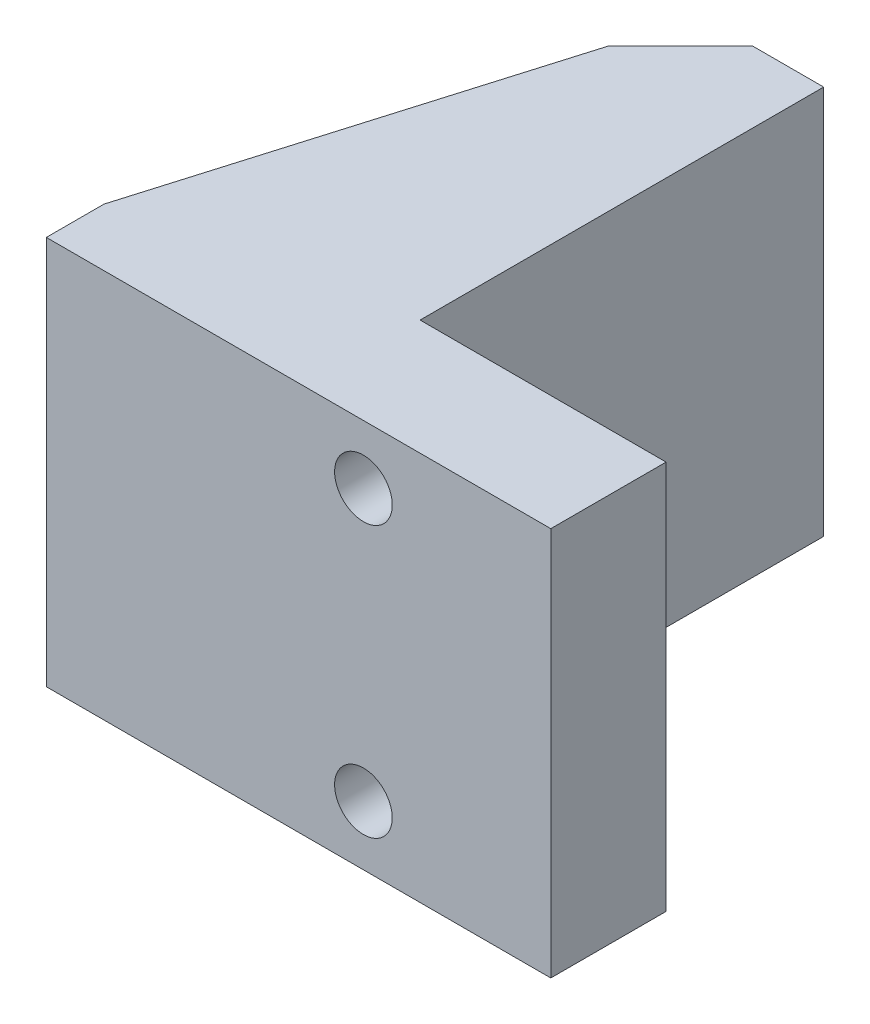
ISO-10303-21;
HEADER;
FILE_DESCRIPTION(('STEP AP214'),'2;1');
FILE_NAME('part.step','',(''),(''),'','','');
FILE_SCHEMA(('AUTOMOTIVE_DESIGN { 1 0 10303 214 1 1 1 1 }'));
ENDSEC;
DATA;
#1=APPLICATION_CONTEXT('core data for automotive mechanical design processes');
#2=APPLICATION_PROTOCOL_DEFINITION('international standard','automotive_design',2000,#1);
#3=PRODUCT_CONTEXT('',#1,'mechanical');
#4=PRODUCT('Part','Part','',(#3));
#5=PRODUCT_RELATED_PRODUCT_CATEGORY('part','',(#4));
#6=PRODUCT_DEFINITION_FORMATION('','',#4);
#7=PRODUCT_DEFINITION_CONTEXT('part definition',#1,'design');
#8=PRODUCT_DEFINITION('design','',#6,#7);
#9=PRODUCT_DEFINITION_SHAPE('','',#8);
#10=(LENGTH_UNIT() NAMED_UNIT(*) SI_UNIT(.MILLI.,.METRE.));
#11=(NAMED_UNIT(*) PLANE_ANGLE_UNIT() SI_UNIT($,.RADIAN.));
#12=(NAMED_UNIT(*) SI_UNIT($,.STERADIAN.) SOLID_ANGLE_UNIT());
#13=UNCERTAINTY_MEASURE_WITH_UNIT(LENGTH_MEASURE(1.E-05),#10,'distance_accuracy_value','');
#14=(GEOMETRIC_REPRESENTATION_CONTEXT(3) GLOBAL_UNCERTAINTY_ASSIGNED_CONTEXT((#13)) GLOBAL_UNIT_ASSIGNED_CONTEXT((#10,
#11,#12)) REPRESENTATION_CONTEXT('',''));
#15=CARTESIAN_POINT('',(0.,0.,0.));
#16=DIRECTION('',(0.,0.,1.));
#17=DIRECTION('',(1.,0.,0.));
#18=AXIS2_PLACEMENT_3D('',#15,#16,#17);
#19=CARTESIAN_POINT('',(0.,0.,5.08));
#20=DIRECTION('',(1.,0.,0.));
#21=DIRECTION('',(0.,0.,-1.));
#22=AXIS2_PLACEMENT_3D('',#19,#20,#21);
#23=PLANE('',#22);
#24=DIRECTION('',(0.,0.,1.));
#25=VECTOR('',#24,1.);
#26=CARTESIAN_POINT('',(0.,-14.605,-14.605));
#27=LINE('',#26,#25);
#28=CARTESIAN_POINT('',(0.,-14.605,-14.605));
#29=VERTEX_POINT('',#28);
#30=CARTESIAN_POINT('',(0.,-14.605,2.54));
#31=VERTEX_POINT('',#30);
#32=EDGE_CURVE('E51',#29,#31,#27,.T.);
#33=ORIENTED_EDGE('',*,*,#32,.T.);
#34=DIRECTION('',(0.,-1.,0.));
#35=VECTOR('',#34,1.);
#36=CARTESIAN_POINT('',(0.,0.,2.54));
#37=LINE('',#36,#35);
#38=CARTESIAN_POINT('',(0.,-2.54,2.54));
#39=VERTEX_POINT('',#38);
#40=EDGE_CURVE('E38',#39,#31,#37,.T.);
#41=ORIENTED_EDGE('',*,*,#40,.F.);
#42=DIRECTION('',(0.,0.,-1.));
#43=VECTOR('',#42,1.);
#44=CARTESIAN_POINT('',(0.,-2.54,-14.605));
#45=LINE('',#44,#43);
#46=CARTESIAN_POINT('',(0.,-2.54,-14.605));
#47=VERTEX_POINT('',#46);
#48=EDGE_CURVE('E150',#39,#47,#45,.T.);
#49=ORIENTED_EDGE('',*,*,#48,.T.);
#50=DIRECTION('',(0.,-1.,0.));
#51=VECTOR('',#50,1.);
#52=CARTESIAN_POINT('',(0.,0.,-14.605));
#53=LINE('',#52,#51);
#54=EDGE_CURVE('E202',#47,#29,#53,.T.);
#55=ORIENTED_EDGE('',*,*,#54,.T.);
#56=EDGE_LOOP('',(#33,#41,#49,#55));
#57=FACE_BOUND('',#56,.T.);
#58=ADVANCED_FACE('F34',(#57),#23,.F.);
#59=CARTESIAN_POINT('',(-5.08,0.,2.54));
#60=DIRECTION('',(0.,0.,1.));
#61=DIRECTION('',(0.,-1.,0.));
#62=AXIS2_PLACEMENT_3D('',#59,#60,#61);
#63=PLANE('',#62);
#64=DIRECTION('',(-1.,0.,0.));
#65=VECTOR('',#64,1.);
#66=CARTESIAN_POINT('',(0.,-14.605,2.54));
#67=LINE('',#66,#65);
#68=CARTESIAN_POINT('',(-5.08,-14.605,2.54));
#69=VERTEX_POINT('',#68);
#70=EDGE_CURVE('E58',#31,#69,#67,.T.);
#71=ORIENTED_EDGE('',*,*,#70,.T.);
#72=DIRECTION('',(0.,-1.,0.));
#73=VECTOR('',#72,1.);
#74=CARTESIAN_POINT('',(-5.08,0.,2.54));
#75=LINE('',#74,#73);
#76=CARTESIAN_POINT('',(-5.08,-2.54,2.54));
#77=VERTEX_POINT('',#76);
#78=EDGE_CURVE('E163',#77,#69,#75,.T.);
#79=ORIENTED_EDGE('',*,*,#78,.F.);
#80=DIRECTION('',(1.,0.,0.));
#81=VECTOR('',#80,1.);
#82=CARTESIAN_POINT('',(0.,-2.54,2.54));
#83=LINE('',#82,#81);
#84=EDGE_CURVE('E148',#77,#39,#83,.T.);
#85=ORIENTED_EDGE('',*,*,#84,.T.);
#86=ORIENTED_EDGE('',*,*,#40,.T.);
#87=EDGE_LOOP('',(#71,#79,#85,#86));
#88=FACE_BOUND('',#87,.T.);
#89=ADVANCED_FACE('F219',(#88),#63,.F.);
#90=CARTESIAN_POINT('',(0.,0.,0.));
#91=DIRECTION('',(0.,0.,1.));
#92=DIRECTION('',(1.,0.,0.));
#93=AXIS2_PLACEMENT_3D('',#90,#91,#92);
#94=PLANE('',#93);
#95=CARTESIAN_POINT('',(8.89,-2.5908,0.));
#96=DIRECTION('',(0.,0.,-1.));
#97=DIRECTION('',(-1.,0.,0.));
#98=AXIS2_PLACEMENT_3D('',#95,#96,#97);
#99=CIRCLE('',#98,2.54);
#100=CARTESIAN_POINT('',(6.35,-2.5908,0.));
#101=VERTEX_POINT('',#100);
#102=EDGE_CURVE('E327',#101,#101,#99,.T.);
#103=ORIENTED_EDGE('',*,*,#102,.F.);
#104=EDGE_LOOP('',(#103));
#105=FACE_BOUND('',#104,.T.);
#106=CARTESIAN_POINT('',(8.89,-14.5288,0.));
#107=DIRECTION('',(0.,0.,-1.));
#108=DIRECTION('',(-1.,0.,0.));
#109=AXIS2_PLACEMENT_3D('',#106,#107,#108);
#110=CIRCLE('',#109,2.54);
#111=CARTESIAN_POINT('',(6.35,-14.5288,0.));
#112=VERTEX_POINT('',#111);
#113=EDGE_CURVE('E195',#112,#112,#110,.T.);
#114=ORIENTED_EDGE('',*,*,#113,.F.);
#115=EDGE_LOOP('',(#114));
#116=FACE_BOUND('',#115,.T.);
#117=DIRECTION('',(0.,-1.,0.));
#118=VECTOR('',#117,1.);
#119=CARTESIAN_POINT('',(6.30770467836258,0.,0.));
#120=LINE('',#119,#118);
#121=CARTESIAN_POINT('',(6.30770467836258,0.,0.));
#122=VERTEX_POINT('',#121);
#123=CARTESIAN_POINT('',(6.30770467836258,-17.145,0.));
#124=VERTEX_POINT('',#123);
#125=EDGE_CURVE('E167',#122,#124,#120,.T.);
#126=ORIENTED_EDGE('',*,*,#125,.F.);
#127=DIRECTION('',(-1.,0.,0.));
#128=VECTOR('',#127,1.);
#129=CARTESIAN_POINT('',(0.,0.,0.));
#130=LINE('',#129,#128);
#131=CARTESIAN_POINT('',(17.145,0.,0.));
#132=VERTEX_POINT('',#131);
#133=EDGE_CURVE('E300',#132,#122,#130,.T.);
#134=ORIENTED_EDGE('',*,*,#133,.F.);
#135=DIRECTION('',(0.,1.,0.));
#136=VECTOR('',#135,1.);
#137=CARTESIAN_POINT('',(17.145,0.,0.));
#138=LINE('',#137,#136);
#139=CARTESIAN_POINT('',(17.145,-17.145,0.));
#140=VERTEX_POINT('',#139);
#141=EDGE_CURVE('E305',#140,#132,#138,.T.);
#142=ORIENTED_EDGE('',*,*,#141,.F.);
#143=DIRECTION('',(1.,0.,0.));
#144=VECTOR('',#143,1.);
#145=CARTESIAN_POINT('',(0.,-17.145,0.));
#146=LINE('',#145,#144);
#147=EDGE_CURVE('E185',#124,#140,#146,.T.);
#148=ORIENTED_EDGE('',*,*,#147,.F.);
#149=EDGE_LOOP('',(#126,#134,#142,#148));
#150=FACE_BOUND('',#149,.T.);
#151=ADVANCED_FACE('F223',(#105,#116,#150),#94,.F.);
#152=CARTESIAN_POINT('',(8.89,-14.5288,5.08));
#153=DIRECTION('',(0.,0.,-1.));
#154=DIRECTION('',(-1.,0.,0.));
#155=AXIS2_PLACEMENT_3D('',#152,#153,#154);
#156=CYLINDRICAL_SURFACE('',#155,1.27);
#157=CARTESIAN_POINT('',(8.89,-14.5288,5.08));
#158=DIRECTION('',(0.,0.,-1.));
#159=DIRECTION('',(-1.,0.,0.));
#160=AXIS2_PLACEMENT_3D('',#157,#158,#159);
#161=CIRCLE('',#160,1.27);
#162=CARTESIAN_POINT('',(7.62,-14.5288,5.08));
#163=VERTEX_POINT('',#162);
#164=EDGE_CURVE('E319',#163,#163,#161,.T.);
#165=ORIENTED_EDGE('',*,*,#164,.F.);
#166=EDGE_LOOP('',(#165));
#167=FACE_BOUND('',#166,.T.);
#168=CARTESIAN_POINT('',(8.89,-14.5288,2.54));
#169=DIRECTION('',(0.,0.,-1.));
#170=DIRECTION('',(-1.,0.,0.));
#171=AXIS2_PLACEMENT_3D('',#168,#169,#170);
#172=CIRCLE('',#171,1.27);
#173=CARTESIAN_POINT('',(7.62,-14.5288,2.54));
#174=VERTEX_POINT('',#173);
#175=EDGE_CURVE('E311',#174,#174,#172,.F.);
#176=ORIENTED_EDGE('',*,*,#175,.F.);
#177=EDGE_LOOP('',(#176));
#178=FACE_BOUND('',#177,.T.);
#179=ADVANCED_FACE('F240',(#167,#178),#156,.F.);
#180=CARTESIAN_POINT('',(8.89,-2.5908,5.08));
#181=DIRECTION('',(0.,0.,-1.));
#182=DIRECTION('',(-1.,0.,0.));
#183=AXIS2_PLACEMENT_3D('',#180,#181,#182);
#184=CYLINDRICAL_SURFACE('',#183,1.27);
#185=CARTESIAN_POINT('',(8.89,-2.5908,5.08));
#186=DIRECTION('',(0.,0.,-1.));
#187=DIRECTION('',(-1.,0.,0.));
#188=AXIS2_PLACEMENT_3D('',#185,#186,#187);
#189=CIRCLE('',#188,1.27);
#190=CARTESIAN_POINT('',(7.62,-2.5908,5.08));
#191=VERTEX_POINT('',#190);
#192=EDGE_CURVE('E324',#191,#191,#189,.T.);
#193=ORIENTED_EDGE('',*,*,#192,.F.);
#194=EDGE_LOOP('',(#193));
#195=FACE_BOUND('',#194,.T.);
#196=CARTESIAN_POINT('',(8.89,-2.5908,2.54));
#197=DIRECTION('',(0.,0.,-1.));
#198=DIRECTION('',(-1.,0.,0.));
#199=AXIS2_PLACEMENT_3D('',#196,#197,#198);
#200=CIRCLE('',#199,1.27);
#201=CARTESIAN_POINT('',(7.62,-2.5908,2.54));
#202=VERTEX_POINT('',#201);
#203=EDGE_CURVE('E317',#202,#202,#200,.F.);
#204=ORIENTED_EDGE('',*,*,#203,.F.);
#205=EDGE_LOOP('',(#204));
#206=FACE_BOUND('',#205,.T.);
#207=ADVANCED_FACE('F229',(#195,#206),#184,.F.);
#208=CARTESIAN_POINT('',(0.,-17.145,5.08));
#209=DIRECTION('',(0.,1.,0.));
#210=DIRECTION('',(0.,0.,1.));
#211=AXIS2_PLACEMENT_3D('',#208,#209,#210);
#212=PLANE('',#211);
#213=DIRECTION('',(0.284088329691374,0.,-0.958798112708387));
#214=VECTOR('',#213,1.);
#215=CARTESIAN_POINT('',(-5.08,-17.145,2.54));
#216=LINE('',#215,#214);
#217=CARTESIAN_POINT('',(-5.08,-17.145,2.54));
#218=VERTEX_POINT('',#217);
#219=CARTESIAN_POINT('',(0.,-17.145,-14.605));
#220=VERTEX_POINT('',#219);
#221=EDGE_CURVE('E132',#218,#220,#216,.T.);
#222=ORIENTED_EDGE('',*,*,#221,.T.);
#223=DIRECTION('',(-0.707106781186546,0.,0.707106781186549));
#224=VECTOR('',#223,1.);
#225=CARTESIAN_POINT('',(3.175,-17.145,-17.78));
#226=LINE('',#225,#224);
#227=CARTESIAN_POINT('',(3.175,-17.145,-17.78));
#228=VERTEX_POINT('',#227);
#229=EDGE_CURVE('E11',#220,#228,#226,.F.);
#230=ORIENTED_EDGE('',*,*,#229,.T.);
#231=DIRECTION('',(-1.,0.,0.));
#232=VECTOR('',#231,1.);
#233=CARTESIAN_POINT('',(0.,-17.145,-17.78));
#234=LINE('',#233,#232);
#235=CARTESIAN_POINT('',(6.30770467836258,-17.145,-17.78));
#236=VERTEX_POINT('',#235);
#237=EDGE_CURVE('E174',#236,#228,#234,.T.);
#238=ORIENTED_EDGE('',*,*,#237,.F.);
#239=DIRECTION('',(0.,0.,1.));
#240=VECTOR('',#239,1.);
#241=CARTESIAN_POINT('',(6.30770467836258,-17.145,-17.78));
#242=LINE('',#241,#240);
#243=EDGE_CURVE('E176',#236,#124,#242,.T.);
#244=ORIENTED_EDGE('',*,*,#243,.T.);
#245=ORIENTED_EDGE('',*,*,#147,.T.);
#246=DIRECTION('',(0.,0.,-1.));
#247=VECTOR('',#246,1.);
#248=CARTESIAN_POINT('',(17.145,-17.145,5.08));
#249=LINE('',#248,#247);
#250=CARTESIAN_POINT('',(17.145,-17.145,5.08));
#251=VERTEX_POINT('',#250);
#252=EDGE_CURVE('E200',#251,#140,#249,.T.);
#253=ORIENTED_EDGE('',*,*,#252,.F.);
#254=DIRECTION('',(1.,0.,0.));
#255=VECTOR('',#254,1.);
#256=CARTESIAN_POINT('',(0.,-17.145,5.08));
#257=LINE('',#256,#255);
#258=CARTESIAN_POINT('',(-5.08,-17.145,5.08));
#259=VERTEX_POINT('',#258);
#260=EDGE_CURVE('E304',#259,#251,#257,.T.);
#261=ORIENTED_EDGE('',*,*,#260,.F.);
#262=DIRECTION('',(0.,0.,1.));
#263=VECTOR('',#262,1.);
#264=CARTESIAN_POINT('',(-5.08,-17.145,5.08));
#265=LINE('',#264,#263);
#266=EDGE_CURVE('E141',#218,#259,#265,.T.);
#267=ORIENTED_EDGE('',*,*,#266,.F.);
#268=EDGE_LOOP('',(#222,#230,#238,#244,#245,#253,#261,#267));
#269=FACE_BOUND('',#268,.T.);
#270=ADVANCED_FACE('F139',(#269),#212,.F.);
#271=CARTESIAN_POINT('',(17.145,0.,5.08));
#272=DIRECTION('',(-1.,0.,0.));
#273=DIRECTION('',(0.,-1.,0.));
#274=AXIS2_PLACEMENT_3D('',#271,#272,#273);
#275=PLANE('',#274);
#276=ORIENTED_EDGE('',*,*,#141,.T.);
#277=DIRECTION('',(0.,0.,-1.));
#278=VECTOR('',#277,1.);
#279=CARTESIAN_POINT('',(17.145,0.,5.08));
#280=LINE('',#279,#278);
#281=CARTESIAN_POINT('',(17.145,0.,5.08));
#282=VERTEX_POINT('',#281);
#283=EDGE_CURVE('E303',#282,#132,#280,.T.);
#284=ORIENTED_EDGE('',*,*,#283,.F.);
#285=DIRECTION('',(0.,1.,0.));
#286=VECTOR('',#285,1.);
#287=CARTESIAN_POINT('',(17.145,0.,5.08));
#288=LINE('',#287,#286);
#289=EDGE_CURVE('E306',#251,#282,#288,.T.);
#290=ORIENTED_EDGE('',*,*,#289,.F.);
#291=ORIENTED_EDGE('',*,*,#252,.T.);
#292=EDGE_LOOP('',(#276,#284,#290,#291));
#293=FACE_BOUND('',#292,.T.);
#294=ADVANCED_FACE('F228',(#293),#275,.F.);
#295=CARTESIAN_POINT('',(0.,0.,5.08));
#296=DIRECTION('',(0.,-1.,0.));
#297=DIRECTION('',(0.,0.,-1.));
#298=AXIS2_PLACEMENT_3D('',#295,#296,#297);
#299=PLANE('',#298);
#300=DIRECTION('',(0.707106781186546,0.,-0.707106781186549));
#301=VECTOR('',#300,1.);
#302=CARTESIAN_POINT('',(3.175,0.,-17.78));
#303=LINE('',#302,#301);
#304=CARTESIAN_POINT('',(3.175,0.,-17.78));
#305=VERTEX_POINT('',#304);
#306=CARTESIAN_POINT('',(0.,0.,-14.605));
#307=VERTEX_POINT('',#306);
#308=EDGE_CURVE('E199',#305,#307,#303,.F.);
#309=ORIENTED_EDGE('',*,*,#308,.T.);
#310=DIRECTION('',(-0.284088329691374,0.,0.958798112708387));
#311=VECTOR('',#310,1.);
#312=CARTESIAN_POINT('',(-5.08,0.,2.54));
#313=LINE('',#312,#311);
#314=CARTESIAN_POINT('',(-5.08,0.,2.54));
#315=VERTEX_POINT('',#314);
#316=EDGE_CURVE('E135',#307,#315,#313,.T.);
#317=ORIENTED_EDGE('',*,*,#316,.T.);
#318=DIRECTION('',(0.,0.,-1.));
#319=VECTOR('',#318,1.);
#320=CARTESIAN_POINT('',(-5.08,0.,5.08));
#321=LINE('',#320,#319);
#322=CARTESIAN_POINT('',(-5.08,0.,5.08));
#323=VERTEX_POINT('',#322);
#324=EDGE_CURVE('E161',#323,#315,#321,.T.);
#325=ORIENTED_EDGE('',*,*,#324,.F.);
#326=DIRECTION('',(-1.,0.,0.));
#327=VECTOR('',#326,1.);
#328=CARTESIAN_POINT('',(0.,0.,5.08));
#329=LINE('',#328,#327);
#330=EDGE_CURVE('E316',#282,#323,#329,.T.);
#331=ORIENTED_EDGE('',*,*,#330,.F.);
#332=ORIENTED_EDGE('',*,*,#283,.T.);
#333=ORIENTED_EDGE('',*,*,#133,.T.);
#334=DIRECTION('',(0.,0.,1.));
#335=VECTOR('',#334,1.);
#336=CARTESIAN_POINT('',(6.30770467836258,0.,-17.78));
#337=LINE('',#336,#335);
#338=CARTESIAN_POINT('',(6.30770467836258,0.,-17.78));
#339=VERTEX_POINT('',#338);
#340=EDGE_CURVE('E190',#339,#122,#337,.T.);
#341=ORIENTED_EDGE('',*,*,#340,.F.);
#342=DIRECTION('',(1.,0.,0.));
#343=VECTOR('',#342,1.);
#344=CARTESIAN_POINT('',(0.,0.,-17.78));
#345=LINE('',#344,#343);
#346=EDGE_CURVE('E170',#305,#339,#345,.T.);
#347=ORIENTED_EDGE('',*,*,#346,.F.);
#348=EDGE_LOOP('',(#309,#317,#325,#331,#332,#333,#341,#347));
#349=FACE_BOUND('',#348,.T.);
#350=ADVANCED_FACE('F232',(#349),#299,.F.);
#351=CARTESIAN_POINT('',(0.,0.,5.08));
#352=DIRECTION('',(0.,0.,1.));
#353=DIRECTION('',(1.,0.,0.));
#354=AXIS2_PLACEMENT_3D('',#351,#352,#353);
#355=PLANE('',#354);
#356=ORIENTED_EDGE('',*,*,#164,.T.);
#357=EDGE_LOOP('',(#356));
#358=FACE_BOUND('',#357,.T.);
#359=ORIENTED_EDGE('',*,*,#192,.T.);
#360=EDGE_LOOP('',(#359));
#361=FACE_BOUND('',#360,.T.);
#362=ORIENTED_EDGE('',*,*,#330,.T.);
#363=DIRECTION('',(0.,1.,0.));
#364=VECTOR('',#363,1.);
#365=CARTESIAN_POINT('',(-5.08,0.,5.08));
#366=LINE('',#365,#364);
#367=EDGE_CURVE('E158',#259,#323,#366,.T.);
#368=ORIENTED_EDGE('',*,*,#367,.F.);
#369=ORIENTED_EDGE('',*,*,#260,.T.);
#370=ORIENTED_EDGE('',*,*,#289,.T.);
#371=EDGE_LOOP('',(#362,#368,#369,#370));
#372=FACE_BOUND('',#371,.T.);
#373=ADVANCED_FACE('F236',(#358,#361,#372),#355,.T.);
#374=CARTESIAN_POINT('',(8.89,-2.5908,2.54));
#375=DIRECTION('',(0.,0.,-1.));
#376=DIRECTION('',(-1.,0.,0.));
#377=AXIS2_PLACEMENT_3D('',#374,#375,#376);
#378=PLANE('',#377);
#379=CARTESIAN_POINT('',(8.89,-2.5908,2.54));
#380=DIRECTION('',(0.,0.,-1.));
#381=DIRECTION('',(-1.,0.,0.));
#382=AXIS2_PLACEMENT_3D('',#379,#380,#381);
#383=CIRCLE('',#382,2.54);
#384=CARTESIAN_POINT('',(6.35,-2.5908,2.54));
#385=VERTEX_POINT('',#384);
#386=EDGE_CURVE('E320',#385,#385,#383,.T.);
#387=ORIENTED_EDGE('',*,*,#386,.T.);
#388=EDGE_LOOP('',(#387));
#389=FACE_BOUND('',#388,.T.);
#390=ORIENTED_EDGE('',*,*,#203,.T.);
#391=EDGE_LOOP('',(#390));
#392=FACE_BOUND('',#391,.T.);
#393=ADVANCED_FACE('F244',(#389,#392),#378,.T.);
#394=CARTESIAN_POINT('',(8.89,-2.5908,2.54));
#395=DIRECTION('',(0.,0.,-1.));
#396=DIRECTION('',(-1.,0.,0.));
#397=AXIS2_PLACEMENT_3D('',#394,#395,#396);
#398=CYLINDRICAL_SURFACE('',#397,2.54);
#399=ORIENTED_EDGE('',*,*,#386,.F.);
#400=EDGE_LOOP('',(#399));
#401=FACE_BOUND('',#400,.T.);
#402=ORIENTED_EDGE('',*,*,#102,.T.);
#403=EDGE_LOOP('',(#402));
#404=FACE_BOUND('',#403,.T.);
#405=ADVANCED_FACE('F252',(#401,#404),#398,.F.);
#406=CARTESIAN_POINT('',(8.89,-14.5288,2.54));
#407=DIRECTION('',(0.,0.,-1.));
#408=DIRECTION('',(-1.,0.,0.));
#409=AXIS2_PLACEMENT_3D('',#406,#407,#408);
#410=PLANE('',#409);
#411=CARTESIAN_POINT('',(8.89,-14.5288,2.54));
#412=DIRECTION('',(0.,0.,-1.));
#413=DIRECTION('',(-1.,0.,0.));
#414=AXIS2_PLACEMENT_3D('',#411,#412,#413);
#415=CIRCLE('',#414,2.54);
#416=CARTESIAN_POINT('',(6.35,-14.5288,2.54));
#417=VERTEX_POINT('',#416);
#418=EDGE_CURVE('E179',#417,#417,#415,.T.);
#419=ORIENTED_EDGE('',*,*,#418,.T.);
#420=EDGE_LOOP('',(#419));
#421=FACE_BOUND('',#420,.T.);
#422=ORIENTED_EDGE('',*,*,#175,.T.);
#423=EDGE_LOOP('',(#422));
#424=FACE_BOUND('',#423,.T.);
#425=ADVANCED_FACE('F255',(#421,#424),#410,.T.);
#426=CARTESIAN_POINT('',(8.89,-14.5288,2.54));
#427=DIRECTION('',(0.,0.,-1.));
#428=DIRECTION('',(-1.,0.,0.));
#429=AXIS2_PLACEMENT_3D('',#426,#427,#428);
#430=CYLINDRICAL_SURFACE('',#429,2.54);
#431=ORIENTED_EDGE('',*,*,#418,.F.);
#432=EDGE_LOOP('',(#431));
#433=FACE_BOUND('',#432,.T.);
#434=ORIENTED_EDGE('',*,*,#113,.T.);
#435=EDGE_LOOP('',(#434));
#436=FACE_BOUND('',#435,.T.);
#437=ADVANCED_FACE('F260',(#433,#436),#430,.F.);
#438=CARTESIAN_POINT('',(6.30770467836258,0.,-17.78));
#439=DIRECTION('',(-1.,0.,0.));
#440=DIRECTION('',(0.,0.,1.));
#441=AXIS2_PLACEMENT_3D('',#438,#439,#440);
#442=PLANE('',#441);
#443=ORIENTED_EDGE('',*,*,#125,.T.);
#444=ORIENTED_EDGE('',*,*,#243,.F.);
#445=DIRECTION('',(0.,-1.,0.));
#446=VECTOR('',#445,1.);
#447=CARTESIAN_POINT('',(6.30770467836258,0.,-17.78));
#448=LINE('',#447,#446);
#449=EDGE_CURVE('E172',#339,#236,#448,.T.);
#450=ORIENTED_EDGE('',*,*,#449,.F.);
#451=ORIENTED_EDGE('',*,*,#340,.T.);
#452=EDGE_LOOP('',(#443,#444,#450,#451));
#453=FACE_BOUND('',#452,.T.);
#454=ADVANCED_FACE('F263',(#453),#442,.F.);
#455=CARTESIAN_POINT('',(0.,0.,-17.78));
#456=DIRECTION('',(0.,0.,1.));
#457=DIRECTION('',(1.,0.,0.));
#458=AXIS2_PLACEMENT_3D('',#455,#456,#457);
#459=PLANE('',#458);
#460=ORIENTED_EDGE('',*,*,#237,.T.);
#461=DIRECTION('',(0.,1.,0.));
#462=VECTOR('',#461,1.);
#463=CARTESIAN_POINT('',(3.175,0.,-17.78));
#464=LINE('',#463,#462);
#465=EDGE_CURVE('E122',#228,#305,#464,.T.);
#466=ORIENTED_EDGE('',*,*,#465,.T.);
#467=ORIENTED_EDGE('',*,*,#346,.T.);
#468=ORIENTED_EDGE('',*,*,#449,.T.);
#469=EDGE_LOOP('',(#460,#466,#467,#468));
#470=FACE_BOUND('',#469,.T.);
#471=ADVANCED_FACE('F270',(#470),#459,.F.);
#472=CARTESIAN_POINT('',(-5.08,0.,0.));
#473=DIRECTION('',(1.,0.,0.));
#474=DIRECTION('',(0.,0.,-1.));
#475=AXIS2_PLACEMENT_3D('',#472,#473,#474);
#476=PLANE('',#475);
#477=ORIENTED_EDGE('',*,*,#367,.T.);
#478=ORIENTED_EDGE('',*,*,#324,.T.);
#479=EDGE_CURVE('E164',#315,#77,#75,.T.);
#480=ORIENTED_EDGE('',*,*,#479,.T.);
#481=ORIENTED_EDGE('',*,*,#78,.T.);
#482=DIRECTION('',(0.,-1.,0.));
#483=VECTOR('',#482,1.);
#484=CARTESIAN_POINT('',(-5.08,-14.605,2.54));
#485=LINE('',#484,#483);
#486=EDGE_CURVE('E136',#69,#218,#485,.T.);
#487=ORIENTED_EDGE('',*,*,#486,.T.);
#488=ORIENTED_EDGE('',*,*,#266,.T.);
#489=EDGE_LOOP('',(#477,#478,#480,#481,#487,#488));
#490=FACE_BOUND('',#489,.T.);
#491=ADVANCED_FACE('F273',(#490),#476,.F.);
#492=CARTESIAN_POINT('',(3.175,0.,-17.78));
#493=DIRECTION('',(0.707106781186549,0.,0.707106781186546));
#494=DIRECTION('',(0.,1.,0.));
#495=AXIS2_PLACEMENT_3D('',#492,#493,#494);
#496=PLANE('',#495);
#497=ORIENTED_EDGE('',*,*,#229,.F.);
#498=DIRECTION('',(0.,-1.,0.));
#499=VECTOR('',#498,1.);
#500=CARTESIAN_POINT('',(0.,-14.605,-14.605));
#501=LINE('',#500,#499);
#502=EDGE_CURVE('E120',#29,#220,#501,.T.);
#503=ORIENTED_EDGE('',*,*,#502,.F.);
#504=ORIENTED_EDGE('',*,*,#54,.F.);
#505=EDGE_CURVE('E44',#307,#47,#53,.T.);
#506=ORIENTED_EDGE('',*,*,#505,.F.);
#507=ORIENTED_EDGE('',*,*,#308,.F.);
#508=ORIENTED_EDGE('',*,*,#465,.F.);
#509=EDGE_LOOP('',(#497,#503,#504,#506,#507,#508));
#510=FACE_BOUND('',#509,.T.);
#511=ADVANCED_FACE('F36',(#510),#496,.F.);
#512=CARTESIAN_POINT('',(-5.08,-2.54,2.54));
#513=DIRECTION('',(-0.958798112708387,0.,-0.284088329691374));
#514=DIRECTION('',(-0.284088329691374,0.,0.958798112708387));
#515=AXIS2_PLACEMENT_3D('',#512,#513,#514);
#516=PLANE('',#515);
#517=ORIENTED_EDGE('',*,*,#316,.F.);
#518=ORIENTED_EDGE('',*,*,#505,.T.);
#519=DIRECTION('',(-0.284088329691374,0.,0.958798112708387));
#520=VECTOR('',#519,1.);
#521=CARTESIAN_POINT('',(-5.08,-2.54,2.54));
#522=LINE('',#521,#520);
#523=EDGE_CURVE('E153',#47,#77,#522,.T.);
#524=ORIENTED_EDGE('',*,*,#523,.T.);
#525=ORIENTED_EDGE('',*,*,#479,.F.);
#526=EDGE_LOOP('',(#517,#518,#524,#525));
#527=FACE_BOUND('',#526,.T.);
#528=ADVANCED_FACE('F279',(#527),#516,.T.);
#529=CARTESIAN_POINT('',(0.,-2.54,0.));
#530=DIRECTION('',(0.,1.,0.));
#531=DIRECTION('',(0.,0.,1.));
#532=AXIS2_PLACEMENT_3D('',#529,#530,#531);
#533=PLANE('',#532);
#534=ORIENTED_EDGE('',*,*,#84,.F.);
#535=ORIENTED_EDGE('',*,*,#523,.F.);
#536=ORIENTED_EDGE('',*,*,#48,.F.);
#537=EDGE_LOOP('',(#534,#535,#536));
#538=FACE_BOUND('',#537,.T.);
#539=ADVANCED_FACE('F216',(#538),#533,.F.);
#540=CARTESIAN_POINT('',(-5.08,-14.605,2.54));
#541=DIRECTION('',(-0.958798112708387,0.,-0.284088329691374));
#542=DIRECTION('',(-0.284088329691374,0.,0.958798112708387));
#543=AXIS2_PLACEMENT_3D('',#540,#541,#542);
#544=PLANE('',#543);
#545=ORIENTED_EDGE('',*,*,#221,.F.);
#546=ORIENTED_EDGE('',*,*,#486,.F.);
#547=DIRECTION('',(0.284088329691374,0.,-0.958798112708387));
#548=VECTOR('',#547,1.);
#549=CARTESIAN_POINT('',(-5.08,-14.605,2.54));
#550=LINE('',#549,#548);
#551=EDGE_CURVE('E134',#69,#29,#550,.T.);
#552=ORIENTED_EDGE('',*,*,#551,.T.);
#553=ORIENTED_EDGE('',*,*,#502,.T.);
#554=EDGE_LOOP('',(#545,#546,#552,#553));
#555=FACE_BOUND('',#554,.T.);
#556=ADVANCED_FACE('F130',(#555),#544,.T.);
#557=CARTESIAN_POINT('',(0.,-14.605,0.));
#558=DIRECTION('',(0.,-1.,0.));
#559=DIRECTION('',(0.,0.,-1.));
#560=AXIS2_PLACEMENT_3D('',#557,#558,#559);
#561=PLANE('',#560);
#562=ORIENTED_EDGE('',*,*,#32,.F.);
#563=ORIENTED_EDGE('',*,*,#551,.F.);
#564=ORIENTED_EDGE('',*,*,#70,.F.);
#565=EDGE_LOOP('',(#562,#563,#564));
#566=FACE_BOUND('',#565,.T.);
#567=ADVANCED_FACE('F210',(#566),#561,.F.);
#568=CLOSED_SHELL('',(#58,#89,#151,#179,#207,#270,#294,#350,#373,#393,#405,#425,#437,#454,#471,
#491,#511,#528,#539,#556,#567));
#569=MANIFOLD_SOLID_BREP('B2',#568);
#570=ADVANCED_BREP_SHAPE_REPRESENTATION('',(#18,#569),#14);
#571=SHAPE_DEFINITION_REPRESENTATION(#9,#570);
ENDSEC;
END-ISO-10303-21;
